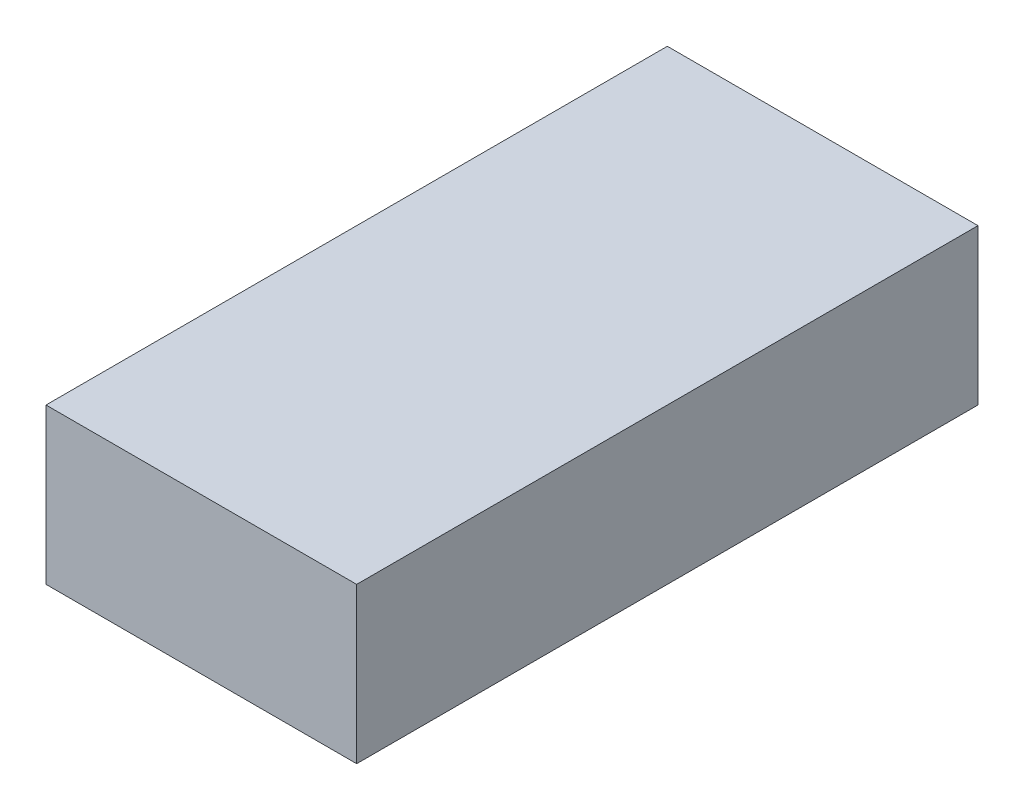
ISO-10303-21;
HEADER;
FILE_DESCRIPTION(('STEP AP214'),'2;1');
FILE_NAME('part.step','',(''),(''),'','','');
FILE_SCHEMA(('AUTOMOTIVE_DESIGN { 1 0 10303 214 1 1 1 1 }'));
ENDSEC;
DATA;
#1=APPLICATION_CONTEXT('core data for automotive mechanical design processes');
#2=APPLICATION_PROTOCOL_DEFINITION('international standard','automotive_design',2000,#1);
#3=PRODUCT_CONTEXT('',#1,'mechanical');
#4=PRODUCT('Part','Part','',(#3));
#5=PRODUCT_RELATED_PRODUCT_CATEGORY('part','',(#4));
#6=PRODUCT_DEFINITION_FORMATION('','',#4);
#7=PRODUCT_DEFINITION_CONTEXT('part definition',#1,'design');
#8=PRODUCT_DEFINITION('design','',#6,#7);
#9=PRODUCT_DEFINITION_SHAPE('','',#8);
#10=(LENGTH_UNIT() NAMED_UNIT(*) SI_UNIT(.MILLI.,.METRE.));
#11=(NAMED_UNIT(*) PLANE_ANGLE_UNIT() SI_UNIT($,.RADIAN.));
#12=(NAMED_UNIT(*) SI_UNIT($,.STERADIAN.) SOLID_ANGLE_UNIT());
#13=UNCERTAINTY_MEASURE_WITH_UNIT(LENGTH_MEASURE(1.E-05),#10,'distance_accuracy_value','');
#14=(GEOMETRIC_REPRESENTATION_CONTEXT(3) GLOBAL_UNCERTAINTY_ASSIGNED_CONTEXT((#13)) GLOBAL_UNIT_ASSIGNED_CONTEXT((#10,
#11,#12)) REPRESENTATION_CONTEXT('',''));
#15=CARTESIAN_POINT('',(0.,0.,0.));
#16=DIRECTION('',(0.,0.,1.));
#17=DIRECTION('',(1.,0.,0.));
#18=AXIS2_PLACEMENT_3D('',#15,#16,#17);
#19=CARTESIAN_POINT('',(0.,25.,0.));
#20=DIRECTION('',(1.,0.,0.));
#21=DIRECTION('',(0.,0.,-1.));
#22=AXIS2_PLACEMENT_3D('',#19,#20,#21);
#23=PLANE('',#22);
#24=DIRECTION('',(0.,0.,1.));
#25=VECTOR('',#24,1.);
#26=CARTESIAN_POINT('',(0.,0.,0.));
#27=LINE('',#26,#25);
#28=CARTESIAN_POINT('',(0.,0.,-100.));
#29=VERTEX_POINT('',#28);
#30=CARTESIAN_POINT('',(0.,0.,0.));
#31=VERTEX_POINT('',#30);
#32=EDGE_CURVE('E96',#29,#31,#27,.T.);
#33=ORIENTED_EDGE('',*,*,#32,.T.);
#34=DIRECTION('',(0.,-1.,0.));
#35=VECTOR('',#34,1.);
#36=CARTESIAN_POINT('',(0.,25.,0.));
#37=LINE('',#36,#35);
#38=CARTESIAN_POINT('',(0.,25.,0.));
#39=VERTEX_POINT('',#38);
#40=EDGE_CURVE('E11',#39,#31,#37,.T.);
#41=ORIENTED_EDGE('',*,*,#40,.F.);
#42=DIRECTION('',(0.,0.,1.));
#43=VECTOR('',#42,1.);
#44=CARTESIAN_POINT('',(0.,25.,0.));
#45=LINE('',#44,#43);
#46=CARTESIAN_POINT('',(0.,25.,-100.));
#47=VERTEX_POINT('',#46);
#48=EDGE_CURVE('E84',#47,#39,#45,.T.);
#49=ORIENTED_EDGE('',*,*,#48,.F.);
#50=DIRECTION('',(0.,-1.,0.));
#51=VECTOR('',#50,1.);
#52=CARTESIAN_POINT('',(0.,25.,-100.));
#53=LINE('',#52,#51);
#54=EDGE_CURVE('E92',#47,#29,#53,.T.);
#55=ORIENTED_EDGE('',*,*,#54,.T.);
#56=EDGE_LOOP('',(#33,#41,#49,#55));
#57=FACE_BOUND('',#56,.T.);
#58=ADVANCED_FACE('F33',(#57),#23,.F.);
#59=CARTESIAN_POINT('',(0.,25.,0.));
#60=DIRECTION('',(0.,0.,-1.));
#61=DIRECTION('',(-1.,0.,0.));
#62=AXIS2_PLACEMENT_3D('',#59,#60,#61);
#63=PLANE('',#62);
#64=DIRECTION('',(1.,0.,0.));
#65=VECTOR('',#64,1.);
#66=CARTESIAN_POINT('',(0.,0.,0.));
#67=LINE('',#66,#65);
#68=CARTESIAN_POINT('',(50.,0.,0.));
#69=VERTEX_POINT('',#68);
#70=EDGE_CURVE('E88',#31,#69,#67,.T.);
#71=ORIENTED_EDGE('',*,*,#70,.T.);
#72=DIRECTION('',(0.,-1.,0.));
#73=VECTOR('',#72,1.);
#74=CARTESIAN_POINT('',(50.,25.,0.));
#75=LINE('',#74,#73);
#76=CARTESIAN_POINT('',(50.,25.,0.));
#77=VERTEX_POINT('',#76);
#78=EDGE_CURVE('E41',#77,#69,#75,.T.);
#79=ORIENTED_EDGE('',*,*,#78,.F.);
#80=DIRECTION('',(1.,0.,0.));
#81=VECTOR('',#80,1.);
#82=CARTESIAN_POINT('',(0.,25.,0.));
#83=LINE('',#82,#81);
#84=EDGE_CURVE('E79',#39,#77,#83,.T.);
#85=ORIENTED_EDGE('',*,*,#84,.F.);
#86=ORIENTED_EDGE('',*,*,#40,.T.);
#87=EDGE_LOOP('',(#71,#79,#85,#86));
#88=FACE_BOUND('',#87,.T.);
#89=ADVANCED_FACE('F87',(#88),#63,.F.);
#90=CARTESIAN_POINT('',(50.,25.,0.));
#91=DIRECTION('',(-1.,0.,0.));
#92=DIRECTION('',(0.,0.,1.));
#93=AXIS2_PLACEMENT_3D('',#90,#91,#92);
#94=PLANE('',#93);
#95=DIRECTION('',(0.,0.,-1.));
#96=VECTOR('',#95,1.);
#97=CARTESIAN_POINT('',(50.,0.,0.));
#98=LINE('',#97,#96);
#99=CARTESIAN_POINT('',(50.,0.,-100.));
#100=VERTEX_POINT('',#99);
#101=EDGE_CURVE('E66',#69,#100,#98,.T.);
#102=ORIENTED_EDGE('',*,*,#101,.T.);
#103=DIRECTION('',(0.,-1.,0.));
#104=VECTOR('',#103,1.);
#105=CARTESIAN_POINT('',(50.,25.,-100.));
#106=LINE('',#105,#104);
#107=CARTESIAN_POINT('',(50.,25.,-100.));
#108=VERTEX_POINT('',#107);
#109=EDGE_CURVE('E89',#108,#100,#106,.T.);
#110=ORIENTED_EDGE('',*,*,#109,.F.);
#111=DIRECTION('',(0.,0.,-1.));
#112=VECTOR('',#111,1.);
#113=CARTESIAN_POINT('',(50.,25.,0.));
#114=LINE('',#113,#112);
#115=EDGE_CURVE('E82',#77,#108,#114,.T.);
#116=ORIENTED_EDGE('',*,*,#115,.F.);
#117=ORIENTED_EDGE('',*,*,#78,.T.);
#118=EDGE_LOOP('',(#102,#110,#116,#117));
#119=FACE_BOUND('',#118,.T.);
#120=ADVANCED_FACE('F90',(#119),#94,.F.);
#121=CARTESIAN_POINT('',(0.,25.,-100.));
#122=DIRECTION('',(0.,0.,1.));
#123=DIRECTION('',(1.,0.,0.));
#124=AXIS2_PLACEMENT_3D('',#121,#122,#123);
#125=PLANE('',#124);
#126=DIRECTION('',(-1.,0.,0.));
#127=VECTOR('',#126,1.);
#128=CARTESIAN_POINT('',(0.,0.,-100.));
#129=LINE('',#128,#127);
#130=EDGE_CURVE('E72',#100,#29,#129,.T.);
#131=ORIENTED_EDGE('',*,*,#130,.T.);
#132=ORIENTED_EDGE('',*,*,#54,.F.);
#133=DIRECTION('',(-1.,0.,0.));
#134=VECTOR('',#133,1.);
#135=CARTESIAN_POINT('',(0.,25.,-100.));
#136=LINE('',#135,#134);
#137=EDGE_CURVE('E49',#108,#47,#136,.T.);
#138=ORIENTED_EDGE('',*,*,#137,.F.);
#139=ORIENTED_EDGE('',*,*,#109,.T.);
#140=EDGE_LOOP('',(#131,#132,#138,#139));
#141=FACE_BOUND('',#140,.T.);
#142=ADVANCED_FACE('F103',(#141),#125,.F.);
#143=CARTESIAN_POINT('',(0.,25.,0.));
#144=DIRECTION('',(0.,-1.,0.));
#145=DIRECTION('',(0.,0.,-1.));
#146=AXIS2_PLACEMENT_3D('',#143,#144,#145);
#147=PLANE('',#146);
#148=ORIENTED_EDGE('',*,*,#48,.T.);
#149=ORIENTED_EDGE('',*,*,#84,.T.);
#150=ORIENTED_EDGE('',*,*,#115,.T.);
#151=ORIENTED_EDGE('',*,*,#137,.T.);
#152=EDGE_LOOP('',(#148,#149,#150,#151));
#153=FACE_BOUND('',#152,.T.);
#154=ADVANCED_FACE('F80',(#153),#147,.F.);
#155=CARTESIAN_POINT('',(0.,0.,0.));
#156=DIRECTION('',(0.,-1.,0.));
#157=DIRECTION('',(0.,0.,-1.));
#158=AXIS2_PLACEMENT_3D('',#155,#156,#157);
#159=PLANE('',#158);
#160=ORIENTED_EDGE('',*,*,#32,.F.);
#161=ORIENTED_EDGE('',*,*,#130,.F.);
#162=ORIENTED_EDGE('',*,*,#101,.F.);
#163=ORIENTED_EDGE('',*,*,#70,.F.);
#164=EDGE_LOOP('',(#160,#161,#162,#163));
#165=FACE_BOUND('',#164,.T.);
#166=ADVANCED_FACE('F106',(#165),#159,.T.);
#167=CLOSED_SHELL('',(#58,#89,#120,#142,#154,#166));
#168=MANIFOLD_SOLID_BREP('B2',#167);
#169=ADVANCED_BREP_SHAPE_REPRESENTATION('',(#18,#168),#14);
#170=SHAPE_DEFINITION_REPRESENTATION(#9,#169);
ENDSEC;
END-ISO-10303-21;
